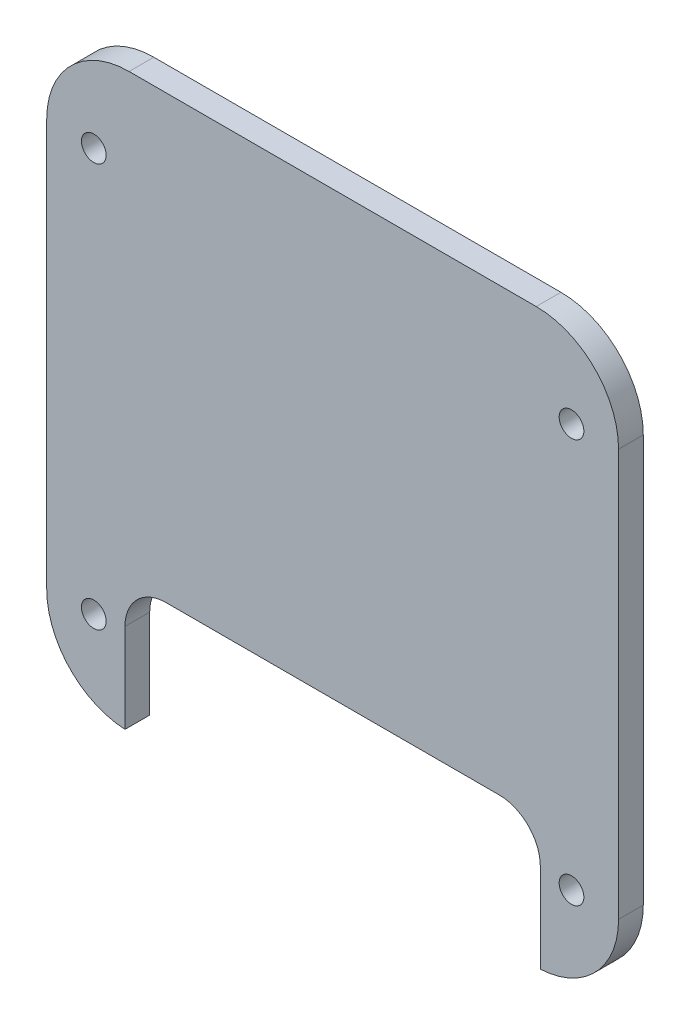
ISO-10303-21;
HEADER;
FILE_DESCRIPTION(('STEP AP214'),'2;1');
FILE_NAME('part.step','',(''),(''),'','','');
FILE_SCHEMA(('AUTOMOTIVE_DESIGN { 1 0 10303 214 1 1 1 1 }'));
ENDSEC;
DATA;
#1=APPLICATION_CONTEXT('core data for automotive mechanical design processes');
#2=APPLICATION_PROTOCOL_DEFINITION('international standard','automotive_design',2000,#1);
#3=PRODUCT_CONTEXT('',#1,'mechanical');
#4=PRODUCT('Part','Part','',(#3));
#5=PRODUCT_RELATED_PRODUCT_CATEGORY('part','',(#4));
#6=PRODUCT_DEFINITION_FORMATION('','',#4);
#7=PRODUCT_DEFINITION_CONTEXT('part definition',#1,'design');
#8=PRODUCT_DEFINITION('design','',#6,#7);
#9=PRODUCT_DEFINITION_SHAPE('','',#8);
#10=(LENGTH_UNIT() NAMED_UNIT(*) SI_UNIT(.MILLI.,.METRE.));
#11=(NAMED_UNIT(*) PLANE_ANGLE_UNIT() SI_UNIT($,.RADIAN.));
#12=(NAMED_UNIT(*) SI_UNIT($,.STERADIAN.) SOLID_ANGLE_UNIT());
#13=UNCERTAINTY_MEASURE_WITH_UNIT(LENGTH_MEASURE(1.E-05),#10,'distance_accuracy_value','');
#14=(GEOMETRIC_REPRESENTATION_CONTEXT(3) GLOBAL_UNCERTAINTY_ASSIGNED_CONTEXT((#13)) GLOBAL_UNIT_ASSIGNED_CONTEXT((#10,
#11,#12)) REPRESENTATION_CONTEXT('',''));
#15=CARTESIAN_POINT('',(0.,0.,0.));
#16=DIRECTION('',(0.,0.,1.));
#17=DIRECTION('',(1.,0.,0.));
#18=AXIS2_PLACEMENT_3D('',#15,#16,#17);
#19=CARTESIAN_POINT('',(34.7153892547083,-34.7153892547083,3.));
#20=DIRECTION('',(-1.,0.,0.));
#21=DIRECTION('',(0.,0.,1.));
#22=AXIS2_PLACEMENT_3D('',#19,#20,#21);
#23=PLANE('',#22);
#24=DIRECTION('',(0.,1.,0.));
#25=VECTOR('',#24,1.);
#26=CARTESIAN_POINT('',(34.7153892547083,-34.7153892547083,3.));
#27=LINE('',#26,#25);
#28=CARTESIAN_POINT('',(34.7153892547083,-24.7278970769892,3.));
#29=VERTEX_POINT('',#28);
#30=CARTESIAN_POINT('',(34.7153892547083,24.7153892547083,3.));
#31=VERTEX_POINT('',#30);
#32=EDGE_CURVE('E251',#29,#31,#27,.T.);
#33=ORIENTED_EDGE('',*,*,#32,.F.);
#34=DIRECTION('',(0.,0.,-1.));
#35=VECTOR('',#34,1.);
#36=CARTESIAN_POINT('',(34.7153892547083,-24.7278970769892,3.));
#37=LINE('',#36,#35);
#38=CARTESIAN_POINT('',(34.7153892547083,-24.7278970769892,0.));
#39=VERTEX_POINT('',#38);
#40=EDGE_CURVE('E150',#29,#39,#37,.T.);
#41=ORIENTED_EDGE('',*,*,#40,.T.);
#42=DIRECTION('',(0.,1.,0.));
#43=VECTOR('',#42,1.);
#44=CARTESIAN_POINT('',(34.7153892547083,-34.7153892547083,0.));
#45=LINE('',#44,#43);
#46=CARTESIAN_POINT('',(34.7153892547083,24.7153892547083,0.));
#47=VERTEX_POINT('',#46);
#48=EDGE_CURVE('E208',#39,#47,#45,.T.);
#49=ORIENTED_EDGE('',*,*,#48,.T.);
#50=DIRECTION('',(0.,0.,-1.));
#51=VECTOR('',#50,1.);
#52=CARTESIAN_POINT('',(34.7153892547083,24.7153892547083,3.));
#53=LINE('',#52,#51);
#54=EDGE_CURVE('E212',#47,#31,#53,.F.);
#55=ORIENTED_EDGE('',*,*,#54,.T.);
#56=EDGE_LOOP('',(#33,#41,#49,#55));
#57=FACE_BOUND('',#56,.T.);
#58=ADVANCED_FACE('F36',(#57),#23,.F.);
#59=CARTESIAN_POINT('',(-34.7153892547083,34.7153892547083,3.));
#60=DIRECTION('',(0.,-1.,0.));
#61=DIRECTION('',(0.,0.,-1.));
#62=AXIS2_PLACEMENT_3D('',#59,#60,#61);
#63=PLANE('',#62);
#64=DIRECTION('',(-1.,0.,0.));
#65=VECTOR('',#64,1.);
#66=CARTESIAN_POINT('',(-34.7153892547083,34.7153892547083,0.));
#67=LINE('',#66,#65);
#68=CARTESIAN_POINT('',(24.7153892547083,34.7153892547083,0.));
#69=VERTEX_POINT('',#68);
#70=CARTESIAN_POINT('',(-24.7153892547083,34.7153892547083,0.));
#71=VERTEX_POINT('',#70);
#72=EDGE_CURVE('E245',#69,#71,#67,.T.);
#73=ORIENTED_EDGE('',*,*,#72,.T.);
#74=DIRECTION('',(0.,0.,-1.));
#75=VECTOR('',#74,1.);
#76=CARTESIAN_POINT('',(-24.7153892547083,34.7153892547083,3.));
#77=LINE('',#76,#75);
#78=CARTESIAN_POINT('',(-24.7153892547083,34.7153892547083,3.));
#79=VERTEX_POINT('',#78);
#80=EDGE_CURVE('E163',#71,#79,#77,.F.);
#81=ORIENTED_EDGE('',*,*,#80,.T.);
#82=DIRECTION('',(-1.,0.,0.));
#83=VECTOR('',#82,1.);
#84=CARTESIAN_POINT('',(-34.7153892547083,34.7153892547083,3.));
#85=LINE('',#84,#83);
#86=CARTESIAN_POINT('',(24.7153892547083,34.7153892547083,3.));
#87=VERTEX_POINT('',#86);
#88=EDGE_CURVE('E230',#87,#79,#85,.T.);
#89=ORIENTED_EDGE('',*,*,#88,.F.);
#90=DIRECTION('',(0.,0.,-1.));
#91=VECTOR('',#90,1.);
#92=CARTESIAN_POINT('',(24.7153892547083,34.7153892547083,3.));
#93=LINE('',#92,#91);
#94=EDGE_CURVE('E188',#87,#69,#93,.T.);
#95=ORIENTED_EDGE('',*,*,#94,.T.);
#96=EDGE_LOOP('',(#73,#81,#89,#95));
#97=FACE_BOUND('',#96,.T.);
#98=ADVANCED_FACE('F248',(#97),#63,.F.);
#99=CARTESIAN_POINT('',(-34.7153892547083,-34.7153892547083,3.));
#100=DIRECTION('',(1.,0.,0.));
#101=DIRECTION('',(0.,0.,-1.));
#102=AXIS2_PLACEMENT_3D('',#99,#100,#101);
#103=PLANE('',#102);
#104=DIRECTION('',(0.,-1.,0.));
#105=VECTOR('',#104,1.);
#106=CARTESIAN_POINT('',(-34.7153892547083,-34.7153892547083,0.));
#107=LINE('',#106,#105);
#108=CARTESIAN_POINT('',(-34.7153892547083,24.7153892547083,0.));
#109=VERTEX_POINT('',#108);
#110=CARTESIAN_POINT('',(-34.7153892547083,-24.7278970769892,0.));
#111=VERTEX_POINT('',#110);
#112=EDGE_CURVE('E246',#109,#111,#107,.T.);
#113=ORIENTED_EDGE('',*,*,#112,.T.);
#114=DIRECTION('',(0.,0.,1.));
#115=VECTOR('',#114,1.);
#116=CARTESIAN_POINT('',(-34.7153892547083,-24.7278970769892,3.));
#117=LINE('',#116,#115);
#118=CARTESIAN_POINT('',(-34.7153892547083,-24.7278970769892,3.));
#119=VERTEX_POINT('',#118);
#120=EDGE_CURVE('E155',#111,#119,#117,.T.);
#121=ORIENTED_EDGE('',*,*,#120,.T.);
#122=DIRECTION('',(0.,-1.,0.));
#123=VECTOR('',#122,1.);
#124=CARTESIAN_POINT('',(-34.7153892547083,-34.7153892547083,3.));
#125=LINE('',#124,#123);
#126=CARTESIAN_POINT('',(-34.7153892547083,24.7153892547083,3.));
#127=VERTEX_POINT('',#126);
#128=EDGE_CURVE('E227',#127,#119,#125,.T.);
#129=ORIENTED_EDGE('',*,*,#128,.F.);
#130=DIRECTION('',(0.,0.,-1.));
#131=VECTOR('',#130,1.);
#132=CARTESIAN_POINT('',(-34.7153892547083,24.7153892547083,3.));
#133=LINE('',#132,#131);
#134=EDGE_CURVE('E151',#127,#109,#133,.T.);
#135=ORIENTED_EDGE('',*,*,#134,.T.);
#136=EDGE_LOOP('',(#113,#121,#129,#135));
#137=FACE_BOUND('',#136,.T.);
#138=ADVANCED_FACE('F236',(#137),#103,.F.);
#139=CARTESIAN_POINT('',(0.,0.,3.));
#140=DIRECTION('',(0.,0.,-1.));
#141=DIRECTION('',(-1.,0.,0.));
#142=AXIS2_PLACEMENT_3D('',#139,#140,#141);
#143=PLANE('',#142);
#144=CARTESIAN_POINT('',(29.,-24.5,3.));
#145=DIRECTION('',(0.,0.,1.));
#146=DIRECTION('',(1.,0.,0.));
#147=AXIS2_PLACEMENT_3D('',#144,#145,#146);
#148=CIRCLE('',#147,1.49999999999999);
#149=CARTESIAN_POINT('',(30.5,-24.5,3.));
#150=VERTEX_POINT('',#149);
#151=EDGE_CURVE('E259',#150,#150,#148,.T.);
#152=ORIENTED_EDGE('',*,*,#151,.F.);
#153=EDGE_LOOP('',(#152));
#154=FACE_BOUND('',#153,.T.);
#155=CARTESIAN_POINT('',(29.,24.5,3.));
#156=DIRECTION('',(0.,0.,1.));
#157=DIRECTION('',(1.,0.,0.));
#158=AXIS2_PLACEMENT_3D('',#155,#156,#157);
#159=CIRCLE('',#158,1.5);
#160=CARTESIAN_POINT('',(30.5,24.5,3.));
#161=VERTEX_POINT('',#160);
#162=EDGE_CURVE('E262',#161,#161,#159,.T.);
#163=ORIENTED_EDGE('',*,*,#162,.F.);
#164=EDGE_LOOP('',(#163));
#165=FACE_BOUND('',#164,.T.);
#166=CARTESIAN_POINT('',(-29.,-24.5,3.));
#167=DIRECTION('',(0.,0.,1.));
#168=DIRECTION('',(1.,0.,0.));
#169=AXIS2_PLACEMENT_3D('',#166,#167,#168);
#170=CIRCLE('',#169,1.5);
#171=CARTESIAN_POINT('',(-27.5,-24.5,3.));
#172=VERTEX_POINT('',#171);
#173=EDGE_CURVE('E265',#172,#172,#170,.T.);
#174=ORIENTED_EDGE('',*,*,#173,.F.);
#175=EDGE_LOOP('',(#174));
#176=FACE_BOUND('',#175,.T.);
#177=CARTESIAN_POINT('',(-29.,24.5,3.));
#178=DIRECTION('',(0.,0.,1.));
#179=DIRECTION('',(1.,0.,0.));
#180=AXIS2_PLACEMENT_3D('',#177,#178,#179);
#181=CIRCLE('',#180,1.5);
#182=CARTESIAN_POINT('',(-27.5,24.5,3.));
#183=VERTEX_POINT('',#182);
#184=EDGE_CURVE('E145',#183,#183,#181,.T.);
#185=ORIENTED_EDGE('',*,*,#184,.F.);
#186=EDGE_LOOP('',(#185));
#187=FACE_BOUND('',#186,.T.);
#188=DIRECTION('',(0.,1.,0.));
#189=VECTOR('',#188,1.);
#190=CARTESIAN_POINT('',(25.2153892547083,-18.8891802563234,3.));
#191=LINE('',#190,#189);
#192=CARTESIAN_POINT('',(25.2153892547083,-34.7153892547083,3.));
#193=VERTEX_POINT('',#192);
#194=CARTESIAN_POINT('',(25.2153892547083,-23.8837601970469,3.));
#195=VERTEX_POINT('',#194);
#196=EDGE_CURVE('E128',#193,#195,#191,.T.);
#197=ORIENTED_EDGE('',*,*,#196,.F.);
#198=CARTESIAN_POINT('',(24.7153892547083,-24.7278970769892,3.));
#199=DIRECTION('',(0.,0.,-1.));
#200=DIRECTION('',(-1.,0.,0.));
#201=AXIS2_PLACEMENT_3D('',#198,#199,#200);
#202=CIRCLE('',#201,10.);
#203=EDGE_CURVE('E140',#193,#29,#202,.F.);
#204=ORIENTED_EDGE('',*,*,#203,.T.);
#205=ORIENTED_EDGE('',*,*,#32,.T.);
#206=CARTESIAN_POINT('',(24.7153892547083,24.7153892547083,3.));
#207=DIRECTION('',(0.,0.,-1.));
#208=DIRECTION('',(-1.,0.,0.));
#209=AXIS2_PLACEMENT_3D('',#206,#207,#208);
#210=CIRCLE('',#209,10.);
#211=EDGE_CURVE('E215',#31,#87,#210,.F.);
#212=ORIENTED_EDGE('',*,*,#211,.T.);
#213=ORIENTED_EDGE('',*,*,#88,.T.);
#214=CARTESIAN_POINT('',(-24.7153892547083,24.7153892547083,3.));
#215=DIRECTION('',(0.,0.,-1.));
#216=DIRECTION('',(-1.,0.,0.));
#217=AXIS2_PLACEMENT_3D('',#214,#215,#216);
#218=CIRCLE('',#217,10.);
#219=EDGE_CURVE('E158',#79,#127,#218,.F.);
#220=ORIENTED_EDGE('',*,*,#219,.T.);
#221=ORIENTED_EDGE('',*,*,#128,.T.);
#222=CARTESIAN_POINT('',(-24.7153892547083,-24.7278970769892,3.));
#223=DIRECTION('',(0.,0.,-1.));
#224=DIRECTION('',(-1.,0.,0.));
#225=AXIS2_PLACEMENT_3D('',#222,#223,#224);
#226=CIRCLE('',#225,10.);
#227=CARTESIAN_POINT('',(-25.2153892547083,-34.7153892547083,3.));
#228=VERTEX_POINT('',#227);
#229=EDGE_CURVE('E152',#119,#228,#226,.F.);
#230=ORIENTED_EDGE('',*,*,#229,.T.);
#231=DIRECTION('',(0.,-1.,0.));
#232=VECTOR('',#231,1.);
#233=CARTESIAN_POINT('',(-25.2153892547083,-34.7153892547083,3.));
#234=LINE('',#233,#232);
#235=CARTESIAN_POINT('',(-25.2153892547083,-23.8837601970469,3.));
#236=VERTEX_POINT('',#235);
#237=EDGE_CURVE('E136',#236,#228,#234,.T.);
#238=ORIENTED_EDGE('',*,*,#237,.F.);
#239=CARTESIAN_POINT('',(-20.2208093139848,-23.8837601970469,3.));
#240=DIRECTION('',(0.,0.,-1.));
#241=DIRECTION('',(-1.,0.,0.));
#242=AXIS2_PLACEMENT_3D('',#239,#240,#241);
#243=CIRCLE('',#242,4.99457994072353);
#244=CARTESIAN_POINT('',(-20.2208093139848,-18.8891802563234,3.));
#245=VERTEX_POINT('',#244);
#246=EDGE_CURVE('E44',#236,#245,#243,.T.);
#247=ORIENTED_EDGE('',*,*,#246,.T.);
#248=DIRECTION('',(-1.,0.,0.));
#249=VECTOR('',#248,1.);
#250=CARTESIAN_POINT('',(-25.2153892547083,-18.8891802563234,3.));
#251=LINE('',#250,#249);
#252=CARTESIAN_POINT('',(20.2208093139848,-18.8891802563234,3.));
#253=VERTEX_POINT('',#252);
#254=EDGE_CURVE('E144',#253,#245,#251,.T.);
#255=ORIENTED_EDGE('',*,*,#254,.F.);
#256=CARTESIAN_POINT('',(20.2208093139848,-23.8837601970469,3.));
#257=DIRECTION('',(0.,0.,-1.));
#258=DIRECTION('',(-1.,0.,0.));
#259=AXIS2_PLACEMENT_3D('',#256,#257,#258);
#260=CIRCLE('',#259,4.99457994072353);
#261=EDGE_CURVE('E143',#253,#195,#260,.T.);
#262=ORIENTED_EDGE('',*,*,#261,.T.);
#263=EDGE_LOOP('',(#197,#204,#205,#212,#213,#220,#221,#230,#238,#247,#255,#262));
#264=FACE_BOUND('',#263,.T.);
#265=ADVANCED_FACE('F139',(#154,#165,#176,#187,#264),#143,.F.);
#266=CARTESIAN_POINT('',(0.,0.,0.));
#267=DIRECTION('',(0.,0.,-1.));
#268=DIRECTION('',(-1.,0.,0.));
#269=AXIS2_PLACEMENT_3D('',#266,#267,#268);
#270=PLANE('',#269);
#271=CARTESIAN_POINT('',(29.,-24.5,0.));
#272=DIRECTION('',(0.,0.,-1.));
#273=DIRECTION('',(-1.,0.,0.));
#274=AXIS2_PLACEMENT_3D('',#271,#272,#273);
#275=CIRCLE('',#274,1.49999999999999);
#276=CARTESIAN_POINT('',(27.5,-24.5,0.));
#277=VERTEX_POINT('',#276);
#278=EDGE_CURVE('E206',#277,#277,#275,.T.);
#279=ORIENTED_EDGE('',*,*,#278,.F.);
#280=EDGE_LOOP('',(#279));
#281=FACE_BOUND('',#280,.T.);
#282=CARTESIAN_POINT('',(29.,24.5,0.));
#283=DIRECTION('',(0.,0.,-1.));
#284=DIRECTION('',(-1.,0.,0.));
#285=AXIS2_PLACEMENT_3D('',#282,#283,#284);
#286=CIRCLE('',#285,1.5);
#287=CARTESIAN_POINT('',(27.5,24.5,0.));
#288=VERTEX_POINT('',#287);
#289=EDGE_CURVE('E203',#288,#288,#286,.T.);
#290=ORIENTED_EDGE('',*,*,#289,.F.);
#291=EDGE_LOOP('',(#290));
#292=FACE_BOUND('',#291,.T.);
#293=CARTESIAN_POINT('',(-29.,-24.5,0.));
#294=DIRECTION('',(0.,0.,-1.));
#295=DIRECTION('',(-1.,0.,0.));
#296=AXIS2_PLACEMENT_3D('',#293,#294,#295);
#297=CIRCLE('',#296,1.5);
#298=CARTESIAN_POINT('',(-30.5,-24.5,0.));
#299=VERTEX_POINT('',#298);
#300=EDGE_CURVE('E200',#299,#299,#297,.T.);
#301=ORIENTED_EDGE('',*,*,#300,.F.);
#302=EDGE_LOOP('',(#301));
#303=FACE_BOUND('',#302,.T.);
#304=CARTESIAN_POINT('',(-29.,24.5,0.));
#305=DIRECTION('',(0.,0.,-1.));
#306=DIRECTION('',(-1.,0.,0.));
#307=AXIS2_PLACEMENT_3D('',#304,#305,#306);
#308=CIRCLE('',#307,1.5);
#309=CARTESIAN_POINT('',(-30.5,24.5,0.));
#310=VERTEX_POINT('',#309);
#311=EDGE_CURVE('E197',#310,#310,#308,.T.);
#312=ORIENTED_EDGE('',*,*,#311,.F.);
#313=EDGE_LOOP('',(#312));
#314=FACE_BOUND('',#313,.T.);
#315=ORIENTED_EDGE('',*,*,#48,.F.);
#316=CARTESIAN_POINT('',(24.7153892547083,-24.7278970769892,0.));
#317=DIRECTION('',(0.,0.,-1.));
#318=DIRECTION('',(-1.,0.,0.));
#319=AXIS2_PLACEMENT_3D('',#316,#317,#318);
#320=CIRCLE('',#319,10.);
#321=CARTESIAN_POINT('',(25.2153892547083,-34.7153892547083,0.));
#322=VERTEX_POINT('',#321);
#323=EDGE_CURVE('E222',#39,#322,#320,.T.);
#324=ORIENTED_EDGE('',*,*,#323,.T.);
#325=DIRECTION('',(0.,-1.,0.));
#326=VECTOR('',#325,1.);
#327=CARTESIAN_POINT('',(25.2153892547083,0.,0.));
#328=LINE('',#327,#326);
#329=CARTESIAN_POINT('',(25.2153892547083,-23.8837601970469,0.));
#330=VERTEX_POINT('',#329);
#331=EDGE_CURVE('E131',#330,#322,#328,.T.);
#332=ORIENTED_EDGE('',*,*,#331,.F.);
#333=CARTESIAN_POINT('',(20.2208093139848,-23.8837601970469,0.));
#334=DIRECTION('',(0.,0.,-1.));
#335=DIRECTION('',(-1.,0.,0.));
#336=AXIS2_PLACEMENT_3D('',#333,#334,#335);
#337=CIRCLE('',#336,4.99457994072353);
#338=CARTESIAN_POINT('',(20.2208093139848,-18.8891802563234,0.));
#339=VERTEX_POINT('',#338);
#340=EDGE_CURVE('E175',#330,#339,#337,.F.);
#341=ORIENTED_EDGE('',*,*,#340,.T.);
#342=DIRECTION('',(1.,0.,0.));
#343=VECTOR('',#342,1.);
#344=CARTESIAN_POINT('',(0.,-18.8891802563234,0.));
#345=LINE('',#344,#343);
#346=CARTESIAN_POINT('',(-20.2208093139848,-18.8891802563234,0.));
#347=VERTEX_POINT('',#346);
#348=EDGE_CURVE('E189',#347,#339,#345,.T.);
#349=ORIENTED_EDGE('',*,*,#348,.F.);
#350=CARTESIAN_POINT('',(-20.2208093139848,-23.8837601970469,0.));
#351=DIRECTION('',(0.,0.,-1.));
#352=DIRECTION('',(-1.,0.,0.));
#353=AXIS2_PLACEMENT_3D('',#350,#351,#352);
#354=CIRCLE('',#353,4.99457994072353);
#355=CARTESIAN_POINT('',(-25.2153892547083,-23.8837601970469,0.));
#356=VERTEX_POINT('',#355);
#357=EDGE_CURVE('E11',#347,#356,#354,.F.);
#358=ORIENTED_EDGE('',*,*,#357,.T.);
#359=DIRECTION('',(0.,1.,0.));
#360=VECTOR('',#359,1.);
#361=CARTESIAN_POINT('',(-25.2153892547083,0.,0.));
#362=LINE('',#361,#360);
#363=CARTESIAN_POINT('',(-25.2153892547083,-34.7153892547083,0.));
#364=VERTEX_POINT('',#363);
#365=EDGE_CURVE('E186',#364,#356,#362,.T.);
#366=ORIENTED_EDGE('',*,*,#365,.F.);
#367=CARTESIAN_POINT('',(-24.7153892547083,-24.7278970769892,0.));
#368=DIRECTION('',(0.,0.,-1.));
#369=DIRECTION('',(-1.,0.,0.));
#370=AXIS2_PLACEMENT_3D('',#367,#368,#369);
#371=CIRCLE('',#370,10.);
#372=EDGE_CURVE('E220',#364,#111,#371,.T.);
#373=ORIENTED_EDGE('',*,*,#372,.T.);
#374=ORIENTED_EDGE('',*,*,#112,.F.);
#375=CARTESIAN_POINT('',(-24.7153892547083,24.7153892547083,0.));
#376=DIRECTION('',(0.,0.,-1.));
#377=DIRECTION('',(-1.,0.,0.));
#378=AXIS2_PLACEMENT_3D('',#375,#376,#377);
#379=CIRCLE('',#378,10.);
#380=EDGE_CURVE('E218',#109,#71,#379,.T.);
#381=ORIENTED_EDGE('',*,*,#380,.T.);
#382=ORIENTED_EDGE('',*,*,#72,.F.);
#383=CARTESIAN_POINT('',(24.7153892547083,24.7153892547083,0.));
#384=DIRECTION('',(0.,0.,-1.));
#385=DIRECTION('',(-1.,0.,0.));
#386=AXIS2_PLACEMENT_3D('',#383,#384,#385);
#387=CIRCLE('',#386,10.);
#388=EDGE_CURVE('E192',#69,#47,#387,.T.);
#389=ORIENTED_EDGE('',*,*,#388,.T.);
#390=EDGE_LOOP('',(#315,#324,#332,#341,#349,#358,#366,#373,#374,#381,#382,#389));
#391=FACE_BOUND('',#390,.T.);
#392=ADVANCED_FACE('F244',(#281,#292,#303,#314,#391),#270,.T.);
#393=CARTESIAN_POINT('',(-25.2153892547083,-34.7153892547083,-7.));
#394=DIRECTION('',(-1.,0.,0.));
#395=DIRECTION('',(0.,0.,1.));
#396=AXIS2_PLACEMENT_3D('',#393,#394,#395);
#397=PLANE('',#396);
#398=ORIENTED_EDGE('',*,*,#365,.T.);
#399=DIRECTION('',(0.,0.,1.));
#400=VECTOR('',#399,1.);
#401=CARTESIAN_POINT('',(-25.2153892547083,-23.8837601970469,3.));
#402=LINE('',#401,#400);
#403=EDGE_CURVE('E172',#356,#236,#402,.T.);
#404=ORIENTED_EDGE('',*,*,#403,.T.);
#405=ORIENTED_EDGE('',*,*,#237,.T.);
#406=DIRECTION('',(0.,0.,1.));
#407=VECTOR('',#406,1.);
#408=CARTESIAN_POINT('',(-25.2153892547083,-34.7153892547083,-7.));
#409=LINE('',#408,#407);
#410=EDGE_CURVE('E135',#364,#228,#409,.T.);
#411=ORIENTED_EDGE('',*,*,#410,.F.);
#412=EDGE_LOOP('',(#398,#404,#405,#411));
#413=FACE_BOUND('',#412,.T.);
#414=ADVANCED_FACE('F184',(#413),#397,.F.);
#415=CARTESIAN_POINT('',(-25.2153892547083,-18.8891802563234,-7.));
#416=DIRECTION('',(0.,1.,0.));
#417=DIRECTION('',(0.,0.,1.));
#418=AXIS2_PLACEMENT_3D('',#415,#416,#417);
#419=PLANE('',#418);
#420=ORIENTED_EDGE('',*,*,#348,.T.);
#421=DIRECTION('',(0.,0.,1.));
#422=VECTOR('',#421,1.);
#423=CARTESIAN_POINT('',(20.2208093139848,-18.8891802563234,3.));
#424=LINE('',#423,#422);
#425=EDGE_CURVE('E167',#339,#253,#424,.T.);
#426=ORIENTED_EDGE('',*,*,#425,.T.);
#427=ORIENTED_EDGE('',*,*,#254,.T.);
#428=DIRECTION('',(0.,0.,1.));
#429=VECTOR('',#428,1.);
#430=CARTESIAN_POINT('',(-20.2208093139848,-18.8891802563234,0.));
#431=LINE('',#430,#429);
#432=EDGE_CURVE('E165',#245,#347,#431,.F.);
#433=ORIENTED_EDGE('',*,*,#432,.T.);
#434=EDGE_LOOP('',(#420,#426,#427,#433));
#435=FACE_BOUND('',#434,.T.);
#436=ADVANCED_FACE('F180',(#435),#419,.F.);
#437=CARTESIAN_POINT('',(25.2153892547083,-18.8891802563234,-7.));
#438=DIRECTION('',(1.,0.,0.));
#439=DIRECTION('',(0.,0.,-1.));
#440=AXIS2_PLACEMENT_3D('',#437,#438,#439);
#441=PLANE('',#440);
#442=ORIENTED_EDGE('',*,*,#196,.T.);
#443=DIRECTION('',(0.,0.,1.));
#444=VECTOR('',#443,1.);
#445=CARTESIAN_POINT('',(25.2153892547083,-23.8837601970469,0.));
#446=LINE('',#445,#444);
#447=EDGE_CURVE('E170',#195,#330,#446,.F.);
#448=ORIENTED_EDGE('',*,*,#447,.T.);
#449=ORIENTED_EDGE('',*,*,#331,.T.);
#450=DIRECTION('',(0.,0.,1.));
#451=VECTOR('',#450,1.);
#452=CARTESIAN_POINT('',(25.2153892547083,-34.7153892547083,-7.));
#453=LINE('',#452,#451);
#454=EDGE_CURVE('E125',#322,#193,#453,.T.);
#455=ORIENTED_EDGE('',*,*,#454,.T.);
#456=EDGE_LOOP('',(#442,#448,#449,#455));
#457=FACE_BOUND('',#456,.T.);
#458=ADVANCED_FACE('F127',(#457),#441,.F.);
#459=CARTESIAN_POINT('',(-29.,24.5,-7.));
#460=DIRECTION('',(0.,0.,1.));
#461=DIRECTION('',(1.,0.,0.));
#462=AXIS2_PLACEMENT_3D('',#459,#460,#461);
#463=CYLINDRICAL_SURFACE('',#462,1.5);
#464=ORIENTED_EDGE('',*,*,#311,.T.);
#465=EDGE_LOOP('',(#464));
#466=FACE_BOUND('',#465,.T.);
#467=ORIENTED_EDGE('',*,*,#184,.T.);
#468=EDGE_LOOP('',(#467));
#469=FACE_BOUND('',#468,.T.);
#470=ADVANCED_FACE('F271',(#466,#469),#463,.F.);
#471=CARTESIAN_POINT('',(-29.,-24.5,-7.));
#472=DIRECTION('',(0.,0.,1.));
#473=DIRECTION('',(1.,0.,0.));
#474=AXIS2_PLACEMENT_3D('',#471,#472,#473);
#475=CYLINDRICAL_SURFACE('',#474,1.5);
#476=ORIENTED_EDGE('',*,*,#300,.T.);
#477=EDGE_LOOP('',(#476));
#478=FACE_BOUND('',#477,.T.);
#479=ORIENTED_EDGE('',*,*,#173,.T.);
#480=EDGE_LOOP('',(#479));
#481=FACE_BOUND('',#480,.T.);
#482=ADVANCED_FACE('F418',(#478,#481),#475,.F.);
#483=CARTESIAN_POINT('',(29.,24.5,-7.));
#484=DIRECTION('',(0.,0.,1.));
#485=DIRECTION('',(1.,0.,0.));
#486=AXIS2_PLACEMENT_3D('',#483,#484,#485);
#487=CYLINDRICAL_SURFACE('',#486,1.5);
#488=ORIENTED_EDGE('',*,*,#289,.T.);
#489=EDGE_LOOP('',(#488));
#490=FACE_BOUND('',#489,.T.);
#491=ORIENTED_EDGE('',*,*,#162,.T.);
#492=EDGE_LOOP('',(#491));
#493=FACE_BOUND('',#492,.T.);
#494=ADVANCED_FACE('F408',(#490,#493),#487,.F.);
#495=CARTESIAN_POINT('',(29.,-24.5,-7.));
#496=DIRECTION('',(0.,0.,1.));
#497=DIRECTION('',(1.,0.,0.));
#498=AXIS2_PLACEMENT_3D('',#495,#496,#497);
#499=CYLINDRICAL_SURFACE('',#498,1.49999999999999);
#500=ORIENTED_EDGE('',*,*,#278,.T.);
#501=EDGE_LOOP('',(#500));
#502=FACE_BOUND('',#501,.T.);
#503=ORIENTED_EDGE('',*,*,#151,.T.);
#504=EDGE_LOOP('',(#503));
#505=FACE_BOUND('',#504,.T.);
#506=ADVANCED_FACE('F297',(#502,#505),#499,.F.);
#507=CARTESIAN_POINT('',(24.7153892547083,24.7153892547083,3.));
#508=DIRECTION('',(0.,0.,-1.));
#509=DIRECTION('',(-1.,0.,0.));
#510=AXIS2_PLACEMENT_3D('',#507,#508,#509);
#511=CYLINDRICAL_SURFACE('',#510,10.);
#512=ORIENTED_EDGE('',*,*,#211,.F.);
#513=ORIENTED_EDGE('',*,*,#54,.F.);
#514=ORIENTED_EDGE('',*,*,#388,.F.);
#515=ORIENTED_EDGE('',*,*,#94,.F.);
#516=EDGE_LOOP('',(#512,#513,#514,#515));
#517=FACE_BOUND('',#516,.T.);
#518=ADVANCED_FACE('F294',(#517),#511,.T.);
#519=CARTESIAN_POINT('',(24.7153892547083,-24.7278970769892,3.));
#520=DIRECTION('',(0.,0.,-1.));
#521=DIRECTION('',(-1.,0.,0.));
#522=AXIS2_PLACEMENT_3D('',#519,#520,#521);
#523=CYLINDRICAL_SURFACE('',#522,10.);
#524=ORIENTED_EDGE('',*,*,#203,.F.);
#525=ORIENTED_EDGE('',*,*,#454,.F.);
#526=ORIENTED_EDGE('',*,*,#323,.F.);
#527=ORIENTED_EDGE('',*,*,#40,.F.);
#528=EDGE_LOOP('',(#524,#525,#526,#527));
#529=FACE_BOUND('',#528,.T.);
#530=ADVANCED_FACE('F148',(#529),#523,.T.);
#531=CARTESIAN_POINT('',(-24.7153892547083,-24.7278970769892,3.));
#532=DIRECTION('',(0.,0.,1.));
#533=DIRECTION('',(1.,0.,0.));
#534=AXIS2_PLACEMENT_3D('',#531,#532,#533);
#535=CYLINDRICAL_SURFACE('',#534,10.);
#536=ORIENTED_EDGE('',*,*,#229,.F.);
#537=ORIENTED_EDGE('',*,*,#120,.F.);
#538=ORIENTED_EDGE('',*,*,#372,.F.);
#539=ORIENTED_EDGE('',*,*,#410,.T.);
#540=EDGE_LOOP('',(#536,#537,#538,#539));
#541=FACE_BOUND('',#540,.T.);
#542=ADVANCED_FACE('F301',(#541),#535,.T.);
#543=CARTESIAN_POINT('',(-24.7153892547083,24.7153892547083,3.));
#544=DIRECTION('',(0.,0.,-1.));
#545=DIRECTION('',(-1.,0.,0.));
#546=AXIS2_PLACEMENT_3D('',#543,#544,#545);
#547=CYLINDRICAL_SURFACE('',#546,10.);
#548=ORIENTED_EDGE('',*,*,#219,.F.);
#549=ORIENTED_EDGE('',*,*,#80,.F.);
#550=ORIENTED_EDGE('',*,*,#380,.F.);
#551=ORIENTED_EDGE('',*,*,#134,.F.);
#552=EDGE_LOOP('',(#548,#549,#550,#551));
#553=FACE_BOUND('',#552,.T.);
#554=ADVANCED_FACE('F240',(#553),#547,.T.);
#555=CARTESIAN_POINT('',(20.2208093139848,-23.8837601970469,-7.));
#556=DIRECTION('',(0.,0.,-1.));
#557=DIRECTION('',(-1.,0.,0.));
#558=AXIS2_PLACEMENT_3D('',#555,#556,#557);
#559=CYLINDRICAL_SURFACE('',#558,4.99457994072353);
#560=ORIENTED_EDGE('',*,*,#340,.F.);
#561=ORIENTED_EDGE('',*,*,#447,.F.);
#562=ORIENTED_EDGE('',*,*,#261,.F.);
#563=ORIENTED_EDGE('',*,*,#425,.F.);
#564=EDGE_LOOP('',(#560,#561,#562,#563));
#565=FACE_BOUND('',#564,.T.);
#566=ADVANCED_FACE('F306',(#565),#559,.F.);
#567=CARTESIAN_POINT('',(-20.2208093139848,-23.8837601970469,-7.));
#568=DIRECTION('',(0.,0.,-1.));
#569=DIRECTION('',(-1.,0.,0.));
#570=AXIS2_PLACEMENT_3D('',#567,#568,#569);
#571=CYLINDRICAL_SURFACE('',#570,4.99457994072353);
#572=ORIENTED_EDGE('',*,*,#357,.F.);
#573=ORIENTED_EDGE('',*,*,#432,.F.);
#574=ORIENTED_EDGE('',*,*,#246,.F.);
#575=ORIENTED_EDGE('',*,*,#403,.F.);
#576=EDGE_LOOP('',(#572,#573,#574,#575));
#577=FACE_BOUND('',#576,.T.);
#578=ADVANCED_FACE('F38',(#577),#571,.F.);
#579=CLOSED_SHELL('',(#58,#98,#138,#265,#392,#414,#436,#458,#470,#482,#494,#506,#518,#530,#542,
#554,#566,#578));
#580=MANIFOLD_SOLID_BREP('B2',#579);
#581=ADVANCED_BREP_SHAPE_REPRESENTATION('',(#18,#580),#14);
#582=SHAPE_DEFINITION_REPRESENTATION(#9,#581);
ENDSEC;
END-ISO-10303-21;
